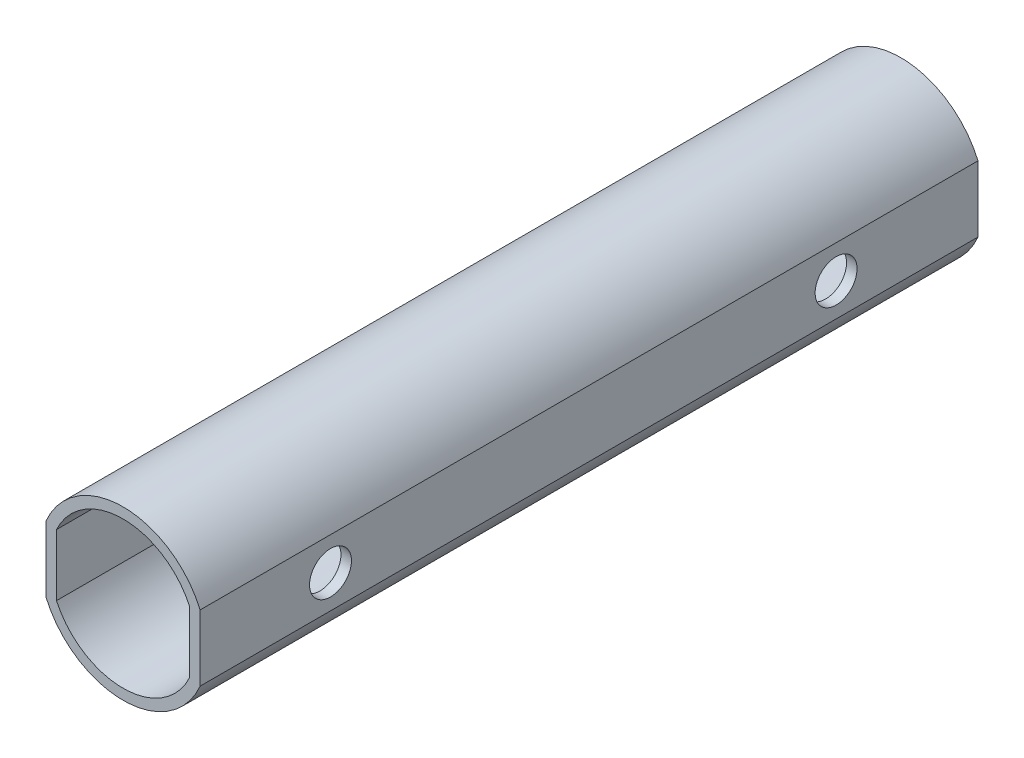
ISO-10303-21;
HEADER;
FILE_DESCRIPTION(('STEP AP214'),'2;1');
FILE_NAME('part.step','',(''),(''),'','','');
FILE_SCHEMA(('AUTOMOTIVE_DESIGN { 1 0 10303 214 1 1 1 1 }'));
ENDSEC;
DATA;
#1=APPLICATION_CONTEXT('core data for automotive mechanical design processes');
#2=APPLICATION_PROTOCOL_DEFINITION('international standard','automotive_design',2000,#1);
#3=PRODUCT_CONTEXT('',#1,'mechanical');
#4=PRODUCT('Part','Part','',(#3));
#5=PRODUCT_RELATED_PRODUCT_CATEGORY('part','',(#4));
#6=PRODUCT_DEFINITION_FORMATION('','',#4);
#7=PRODUCT_DEFINITION_CONTEXT('part definition',#1,'design');
#8=PRODUCT_DEFINITION('design','',#6,#7);
#9=PRODUCT_DEFINITION_SHAPE('','',#8);
#10=(LENGTH_UNIT() NAMED_UNIT(*) SI_UNIT(.MILLI.,.METRE.));
#11=(NAMED_UNIT(*) PLANE_ANGLE_UNIT() SI_UNIT($,.RADIAN.));
#12=(NAMED_UNIT(*) SI_UNIT($,.STERADIAN.) SOLID_ANGLE_UNIT());
#13=UNCERTAINTY_MEASURE_WITH_UNIT(LENGTH_MEASURE(1.E-05),#10,'distance_accuracy_value','');
#14=(GEOMETRIC_REPRESENTATION_CONTEXT(3) GLOBAL_UNCERTAINTY_ASSIGNED_CONTEXT((#13)) GLOBAL_UNIT_ASSIGNED_CONTEXT((#10,
#11,#12)) REPRESENTATION_CONTEXT('',''));
#15=CARTESIAN_POINT('',(0.,0.,0.));
#16=DIRECTION('',(0.,0.,1.));
#17=DIRECTION('',(1.,0.,0.));
#18=AXIS2_PLACEMENT_3D('',#15,#16,#17);
#19=CARTESIAN_POINT('',(0.,0.,117.85));
#20=DIRECTION('',(0.,0.,1.));
#21=DIRECTION('',(1.,0.,0.));
#22=AXIS2_PLACEMENT_3D('',#19,#20,#21);
#23=PLANE('',#22);
#24=CARTESIAN_POINT('',(0.,0.,117.85));
#25=DIRECTION('',(0.,0.,1.));
#26=DIRECTION('',(1.,0.,0.));
#27=AXIS2_PLACEMENT_3D('',#24,#25,#26);
#28=CIRCLE('',#27,12.7);
#29=CARTESIAN_POINT('',(11.6743308159397,5.,117.85));
#30=VERTEX_POINT('',#29);
#31=CARTESIAN_POINT('',(-11.6743308159397,5.,117.85));
#32=VERTEX_POINT('',#31);
#33=EDGE_CURVE('E142',#30,#32,#28,.T.);
#34=ORIENTED_EDGE('',*,*,#33,.T.);
#35=DIRECTION('',(0.,-1.,0.));
#36=VECTOR('',#35,1.);
#37=CARTESIAN_POINT('',(-11.6743308159397,5.,117.85));
#38=LINE('',#37,#36);
#39=CARTESIAN_POINT('',(-11.6743308159397,-4.99999999999999,117.85));
#40=VERTEX_POINT('',#39);
#41=EDGE_CURVE('E145',#32,#40,#38,.T.);
#42=ORIENTED_EDGE('',*,*,#41,.T.);
#43=CARTESIAN_POINT('',(0.,0.,117.85));
#44=DIRECTION('',(0.,0.,1.));
#45=DIRECTION('',(1.,0.,0.));
#46=AXIS2_PLACEMENT_3D('',#43,#44,#45);
#47=CIRCLE('',#46,12.7);
#48=CARTESIAN_POINT('',(11.6743308159397,-5.,117.85));
#49=VERTEX_POINT('',#48);
#50=EDGE_CURVE('E148',#40,#49,#47,.T.);
#51=ORIENTED_EDGE('',*,*,#50,.T.);
#52=DIRECTION('',(0.,1.,0.));
#53=VECTOR('',#52,1.);
#54=CARTESIAN_POINT('',(11.6743308159397,5.,117.85));
#55=LINE('',#54,#53);
#56=EDGE_CURVE('E150',#49,#30,#55,.T.);
#57=ORIENTED_EDGE('',*,*,#56,.T.);
#58=EDGE_LOOP('',(#34,#42,#51,#57));
#59=FACE_BOUND('',#58,.T.);
#60=DIRECTION('',(0.,-1.,0.));
#61=VECTOR('',#60,1.);
#62=CARTESIAN_POINT('',(-10.0868308159397,4.66299263784629,117.85));
#63=LINE('',#62,#61);
#64=CARTESIAN_POINT('',(-10.0868308159397,4.66299263784629,117.85));
#65=VERTEX_POINT('',#64);
#66=CARTESIAN_POINT('',(-10.0868308159397,-4.66299263784629,117.85));
#67=VERTEX_POINT('',#66);
#68=EDGE_CURVE('E112',#65,#67,#63,.T.);
#69=ORIENTED_EDGE('',*,*,#68,.F.);
#70=CARTESIAN_POINT('',(0.,0.,117.85));
#71=DIRECTION('',(0.,0.,1.));
#72=DIRECTION('',(1.,0.,0.));
#73=AXIS2_PLACEMENT_3D('',#70,#71,#72);
#74=CIRCLE('',#73,11.1125);
#75=CARTESIAN_POINT('',(10.0868308159397,4.66299263784629,117.85));
#76=VERTEX_POINT('',#75);
#77=EDGE_CURVE('E104',#76,#65,#74,.T.);
#78=ORIENTED_EDGE('',*,*,#77,.F.);
#79=DIRECTION('',(0.,1.,0.));
#80=VECTOR('',#79,1.);
#81=CARTESIAN_POINT('',(10.0868308159397,4.66299263784629,117.85));
#82=LINE('',#81,#80);
#83=CARTESIAN_POINT('',(10.0868308159397,-4.66299263784629,117.85));
#84=VERTEX_POINT('',#83);
#85=EDGE_CURVE('E126',#84,#76,#82,.T.);
#86=ORIENTED_EDGE('',*,*,#85,.F.);
#87=CARTESIAN_POINT('',(0.,0.,117.85));
#88=DIRECTION('',(0.,0.,1.));
#89=DIRECTION('',(1.,0.,0.));
#90=AXIS2_PLACEMENT_3D('',#87,#88,#89);
#91=CIRCLE('',#90,11.1125);
#92=EDGE_CURVE('E124',#67,#84,#91,.T.);
#93=ORIENTED_EDGE('',*,*,#92,.F.);
#94=EDGE_LOOP('',(#69,#78,#86,#93));
#95=FACE_BOUND('',#94,.T.);
#96=ADVANCED_FACE('F37',(#59,#95),#23,.T.);
#97=CARTESIAN_POINT('',(0.,0.,0.));
#98=DIRECTION('',(0.,0.,1.));
#99=DIRECTION('',(1.,0.,0.));
#100=AXIS2_PLACEMENT_3D('',#97,#98,#99);
#101=PLANE('',#100);
#102=CARTESIAN_POINT('',(0.,0.,0.));
#103=DIRECTION('',(0.,0.,1.));
#104=DIRECTION('',(1.,0.,0.));
#105=AXIS2_PLACEMENT_3D('',#102,#103,#104);
#106=CIRCLE('',#105,12.7);
#107=CARTESIAN_POINT('',(11.6743308159397,5.,0.));
#108=VERTEX_POINT('',#107);
#109=CARTESIAN_POINT('',(-11.6743308159397,5.,0.));
#110=VERTEX_POINT('',#109);
#111=EDGE_CURVE('E120',#108,#110,#106,.T.);
#112=ORIENTED_EDGE('',*,*,#111,.F.);
#113=DIRECTION('',(0.,1.,0.));
#114=VECTOR('',#113,1.);
#115=CARTESIAN_POINT('',(11.6743308159397,5.,0.));
#116=LINE('',#115,#114);
#117=CARTESIAN_POINT('',(11.6743308159397,-5.,0.));
#118=VERTEX_POINT('',#117);
#119=EDGE_CURVE('E146',#118,#108,#116,.T.);
#120=ORIENTED_EDGE('',*,*,#119,.F.);
#121=CARTESIAN_POINT('',(0.,0.,0.));
#122=DIRECTION('',(0.,0.,1.));
#123=DIRECTION('',(1.,0.,0.));
#124=AXIS2_PLACEMENT_3D('',#121,#122,#123);
#125=CIRCLE('',#124,12.7);
#126=CARTESIAN_POINT('',(-11.6743308159397,-4.99999999999999,0.));
#127=VERTEX_POINT('',#126);
#128=EDGE_CURVE('E157',#127,#118,#125,.T.);
#129=ORIENTED_EDGE('',*,*,#128,.F.);
#130=DIRECTION('',(0.,-1.,0.));
#131=VECTOR('',#130,1.);
#132=CARTESIAN_POINT('',(-11.6743308159397,5.,0.));
#133=LINE('',#132,#131);
#134=EDGE_CURVE('E155',#110,#127,#133,.T.);
#135=ORIENTED_EDGE('',*,*,#134,.F.);
#136=EDGE_LOOP('',(#112,#120,#129,#135));
#137=FACE_BOUND('',#136,.T.);
#138=CARTESIAN_POINT('',(0.,0.,0.));
#139=DIRECTION('',(0.,0.,1.));
#140=DIRECTION('',(1.,0.,0.));
#141=AXIS2_PLACEMENT_3D('',#138,#139,#140);
#142=CIRCLE('',#141,11.1125);
#143=CARTESIAN_POINT('',(10.0868308159397,4.66299263784629,0.));
#144=VERTEX_POINT('',#143);
#145=CARTESIAN_POINT('',(-10.0868308159397,4.66299263784629,0.));
#146=VERTEX_POINT('',#145);
#147=EDGE_CURVE('E62',#144,#146,#142,.T.);
#148=ORIENTED_EDGE('',*,*,#147,.T.);
#149=DIRECTION('',(0.,-1.,0.));
#150=VECTOR('',#149,1.);
#151=CARTESIAN_POINT('',(-10.0868308159397,4.66299263784629,0.));
#152=LINE('',#151,#150);
#153=CARTESIAN_POINT('',(-10.0868308159397,-4.66299263784629,0.));
#154=VERTEX_POINT('',#153);
#155=EDGE_CURVE('E119',#146,#154,#152,.T.);
#156=ORIENTED_EDGE('',*,*,#155,.T.);
#157=CARTESIAN_POINT('',(0.,0.,0.));
#158=DIRECTION('',(0.,0.,1.));
#159=DIRECTION('',(1.,0.,0.));
#160=AXIS2_PLACEMENT_3D('',#157,#158,#159);
#161=CIRCLE('',#160,11.1125);
#162=CARTESIAN_POINT('',(10.0868308159397,-4.66299263784629,0.));
#163=VERTEX_POINT('',#162);
#164=EDGE_CURVE('E134',#154,#163,#161,.T.);
#165=ORIENTED_EDGE('',*,*,#164,.T.);
#166=DIRECTION('',(0.,1.,0.));
#167=VECTOR('',#166,1.);
#168=CARTESIAN_POINT('',(10.0868308159397,4.66299263784629,0.));
#169=LINE('',#168,#167);
#170=EDGE_CURVE('E113',#163,#144,#169,.T.);
#171=ORIENTED_EDGE('',*,*,#170,.T.);
#172=EDGE_LOOP('',(#148,#156,#165,#171));
#173=FACE_BOUND('',#172,.T.);
#174=ADVANCED_FACE('F204',(#137,#173),#101,.F.);
#175=CARTESIAN_POINT('',(0.,0.,117.85));
#176=DIRECTION('',(0.,0.,-1.));
#177=DIRECTION('',(-1.,0.,0.));
#178=AXIS2_PLACEMENT_3D('',#175,#176,#177);
#179=CYLINDRICAL_SURFACE('',#178,12.7);
#180=ORIENTED_EDGE('',*,*,#111,.T.);
#181=DIRECTION('',(0.,0.,-1.));
#182=VECTOR('',#181,1.);
#183=CARTESIAN_POINT('',(-11.6743308159397,5.,117.85));
#184=LINE('',#183,#182);
#185=EDGE_CURVE('E11',#32,#110,#184,.T.);
#186=ORIENTED_EDGE('',*,*,#185,.F.);
#187=ORIENTED_EDGE('',*,*,#33,.F.);
#188=DIRECTION('',(0.,0.,-1.));
#189=VECTOR('',#188,1.);
#190=CARTESIAN_POINT('',(11.6743308159397,5.,117.85));
#191=LINE('',#190,#189);
#192=EDGE_CURVE('E152',#30,#108,#191,.T.);
#193=ORIENTED_EDGE('',*,*,#192,.T.);
#194=EDGE_LOOP('',(#180,#186,#187,#193));
#195=FACE_BOUND('',#194,.T.);
#196=ADVANCED_FACE('F39',(#195),#179,.T.);
#197=CARTESIAN_POINT('',(-11.6743308159397,5.,117.85));
#198=DIRECTION('',(1.,0.,0.));
#199=DIRECTION('',(0.,0.,-1.));
#200=AXIS2_PLACEMENT_3D('',#197,#198,#199);
#201=PLANE('',#200);
#202=CARTESIAN_POINT('',(-11.6743308159397,0.,21.5));
#203=DIRECTION('',(1.,0.,0.));
#204=DIRECTION('',(0.,0.,-1.));
#205=AXIS2_PLACEMENT_3D('',#202,#203,#204);
#206=CIRCLE('',#205,3.175);
#207=CARTESIAN_POINT('',(-11.6743308159397,0.,18.325));
#208=VERTEX_POINT('',#207);
#209=EDGE_CURVE('E169',#208,#208,#206,.F.);
#210=ORIENTED_EDGE('',*,*,#209,.F.);
#211=EDGE_LOOP('',(#210));
#212=FACE_BOUND('',#211,.T.);
#213=CARTESIAN_POINT('',(-11.6743308159397,0.,98.1));
#214=DIRECTION('',(1.,0.,0.));
#215=DIRECTION('',(0.,0.,-1.));
#216=AXIS2_PLACEMENT_3D('',#213,#214,#215);
#217=CIRCLE('',#216,3.175);
#218=CARTESIAN_POINT('',(-11.6743308159397,0.,94.925));
#219=VERTEX_POINT('',#218);
#220=EDGE_CURVE('E183',#219,#219,#217,.F.);
#221=ORIENTED_EDGE('',*,*,#220,.F.);
#222=EDGE_LOOP('',(#221));
#223=FACE_BOUND('',#222,.T.);
#224=ORIENTED_EDGE('',*,*,#134,.T.);
#225=DIRECTION('',(0.,0.,-1.));
#226=VECTOR('',#225,1.);
#227=CARTESIAN_POINT('',(-11.6743308159397,-4.99999999999999,117.85));
#228=LINE('',#227,#226);
#229=EDGE_CURVE('E46',#40,#127,#228,.T.);
#230=ORIENTED_EDGE('',*,*,#229,.F.);
#231=ORIENTED_EDGE('',*,*,#41,.F.);
#232=ORIENTED_EDGE('',*,*,#185,.T.);
#233=EDGE_LOOP('',(#224,#230,#231,#232));
#234=FACE_BOUND('',#233,.T.);
#235=ADVANCED_FACE('F229',(#212,#223,#234),#201,.F.);
#236=CARTESIAN_POINT('',(0.,0.,117.85));
#237=DIRECTION('',(0.,0.,-1.));
#238=DIRECTION('',(-1.,0.,0.));
#239=AXIS2_PLACEMENT_3D('',#236,#237,#238);
#240=CYLINDRICAL_SURFACE('',#239,12.7);
#241=ORIENTED_EDGE('',*,*,#128,.T.);
#242=DIRECTION('',(0.,0.,-1.));
#243=VECTOR('',#242,1.);
#244=CARTESIAN_POINT('',(11.6743308159397,-5.,117.85));
#245=LINE('',#244,#243);
#246=EDGE_CURVE('E162',#49,#118,#245,.T.);
#247=ORIENTED_EDGE('',*,*,#246,.F.);
#248=ORIENTED_EDGE('',*,*,#50,.F.);
#249=ORIENTED_EDGE('',*,*,#229,.T.);
#250=EDGE_LOOP('',(#241,#247,#248,#249));
#251=FACE_BOUND('',#250,.T.);
#252=ADVANCED_FACE('F226',(#251),#240,.T.);
#253=CARTESIAN_POINT('',(11.6743308159397,5.,117.85));
#254=DIRECTION('',(-1.,0.,0.));
#255=DIRECTION('',(0.,0.,1.));
#256=AXIS2_PLACEMENT_3D('',#253,#254,#255);
#257=PLANE('',#256);
#258=CARTESIAN_POINT('',(11.6743308159397,0.,21.5));
#259=DIRECTION('',(1.,0.,0.));
#260=DIRECTION('',(0.,0.,-1.));
#261=AXIS2_PLACEMENT_3D('',#258,#259,#260);
#262=CIRCLE('',#261,3.175);
#263=CARTESIAN_POINT('',(11.6743308159397,0.,18.325));
#264=VERTEX_POINT('',#263);
#265=EDGE_CURVE('E175',#264,#264,#262,.T.);
#266=ORIENTED_EDGE('',*,*,#265,.F.);
#267=EDGE_LOOP('',(#266));
#268=FACE_BOUND('',#267,.T.);
#269=CARTESIAN_POINT('',(11.6743308159397,0.,98.1));
#270=DIRECTION('',(1.,0.,0.));
#271=DIRECTION('',(0.,0.,-1.));
#272=AXIS2_PLACEMENT_3D('',#269,#270,#271);
#273=CIRCLE('',#272,3.175);
#274=CARTESIAN_POINT('',(11.6743308159397,0.,94.925));
#275=VERTEX_POINT('',#274);
#276=EDGE_CURVE('E180',#275,#275,#273,.T.);
#277=ORIENTED_EDGE('',*,*,#276,.F.);
#278=EDGE_LOOP('',(#277));
#279=FACE_BOUND('',#278,.T.);
#280=ORIENTED_EDGE('',*,*,#119,.T.);
#281=ORIENTED_EDGE('',*,*,#192,.F.);
#282=ORIENTED_EDGE('',*,*,#56,.F.);
#283=ORIENTED_EDGE('',*,*,#246,.T.);
#284=EDGE_LOOP('',(#280,#281,#282,#283));
#285=FACE_BOUND('',#284,.T.);
#286=ADVANCED_FACE('F223',(#268,#279,#285),#257,.F.);
#287=CARTESIAN_POINT('',(0.,0.,117.85));
#288=DIRECTION('',(0.,0.,-1.));
#289=DIRECTION('',(-1.,0.,0.));
#290=AXIS2_PLACEMENT_3D('',#287,#288,#289);
#291=CYLINDRICAL_SURFACE('',#290,11.1125);
#292=ORIENTED_EDGE('',*,*,#147,.F.);
#293=DIRECTION('',(0.,0.,-1.));
#294=VECTOR('',#293,1.);
#295=CARTESIAN_POINT('',(10.0868308159397,4.66299263784629,117.85));
#296=LINE('',#295,#294);
#297=EDGE_CURVE('E108',#76,#144,#296,.T.);
#298=ORIENTED_EDGE('',*,*,#297,.F.);
#299=ORIENTED_EDGE('',*,*,#77,.T.);
#300=DIRECTION('',(0.,0.,-1.));
#301=VECTOR('',#300,1.);
#302=CARTESIAN_POINT('',(-10.0868308159397,4.66299263784629,117.85));
#303=LINE('',#302,#301);
#304=EDGE_CURVE('E107',#65,#146,#303,.T.);
#305=ORIENTED_EDGE('',*,*,#304,.T.);
#306=EDGE_LOOP('',(#292,#298,#299,#305));
#307=FACE_BOUND('',#306,.T.);
#308=ADVANCED_FACE('F106',(#307),#291,.F.);
#309=CARTESIAN_POINT('',(-10.0868308159397,4.66299263784629,117.85));
#310=DIRECTION('',(1.,0.,0.));
#311=DIRECTION('',(0.,0.,-1.));
#312=AXIS2_PLACEMENT_3D('',#309,#310,#311);
#313=PLANE('',#312);
#314=CARTESIAN_POINT('',(-10.0868308159397,0.,21.5));
#315=DIRECTION('',(1.,0.,0.));
#316=DIRECTION('',(0.,0.,-1.));
#317=AXIS2_PLACEMENT_3D('',#314,#315,#316);
#318=CIRCLE('',#317,3.175);
#319=CARTESIAN_POINT('',(-10.0868308159397,0.,18.325));
#320=VERTEX_POINT('',#319);
#321=EDGE_CURVE('E132',#320,#320,#318,.T.);
#322=ORIENTED_EDGE('',*,*,#321,.F.);
#323=EDGE_LOOP('',(#322));
#324=FACE_BOUND('',#323,.T.);
#325=CARTESIAN_POINT('',(-10.0868308159397,0.,98.1));
#326=DIRECTION('',(1.,0.,0.));
#327=DIRECTION('',(0.,0.,-1.));
#328=AXIS2_PLACEMENT_3D('',#325,#326,#327);
#329=CIRCLE('',#328,3.175);
#330=CARTESIAN_POINT('',(-10.0868308159397,0.,94.925));
#331=VERTEX_POINT('',#330);
#332=EDGE_CURVE('E168',#331,#331,#329,.T.);
#333=ORIENTED_EDGE('',*,*,#332,.F.);
#334=EDGE_LOOP('',(#333));
#335=FACE_BOUND('',#334,.T.);
#336=ORIENTED_EDGE('',*,*,#155,.F.);
#337=ORIENTED_EDGE('',*,*,#304,.F.);
#338=ORIENTED_EDGE('',*,*,#68,.T.);
#339=DIRECTION('',(0.,0.,-1.));
#340=VECTOR('',#339,1.);
#341=CARTESIAN_POINT('',(-10.0868308159397,-4.66299263784629,117.85));
#342=LINE('',#341,#340);
#343=EDGE_CURVE('E121',#67,#154,#342,.T.);
#344=ORIENTED_EDGE('',*,*,#343,.T.);
#345=EDGE_LOOP('',(#336,#337,#338,#344));
#346=FACE_BOUND('',#345,.T.);
#347=ADVANCED_FACE('F116',(#324,#335,#346),#313,.T.);
#348=CARTESIAN_POINT('',(0.,0.,117.85));
#349=DIRECTION('',(0.,0.,-1.));
#350=DIRECTION('',(-1.,0.,0.));
#351=AXIS2_PLACEMENT_3D('',#348,#349,#350);
#352=CYLINDRICAL_SURFACE('',#351,11.1125);
#353=ORIENTED_EDGE('',*,*,#164,.F.);
#354=ORIENTED_EDGE('',*,*,#343,.F.);
#355=ORIENTED_EDGE('',*,*,#92,.T.);
#356=DIRECTION('',(0.,0.,-1.));
#357=VECTOR('',#356,1.);
#358=CARTESIAN_POINT('',(10.0868308159397,-4.66299263784629,117.85));
#359=LINE('',#358,#357);
#360=EDGE_CURVE('E54',#84,#163,#359,.T.);
#361=ORIENTED_EDGE('',*,*,#360,.T.);
#362=EDGE_LOOP('',(#353,#354,#355,#361));
#363=FACE_BOUND('',#362,.T.);
#364=ADVANCED_FACE('F200',(#363),#352,.F.);
#365=CARTESIAN_POINT('',(10.0868308159397,4.66299263784629,117.85));
#366=DIRECTION('',(-1.,0.,0.));
#367=DIRECTION('',(0.,0.,1.));
#368=AXIS2_PLACEMENT_3D('',#365,#366,#367);
#369=PLANE('',#368);
#370=CARTESIAN_POINT('',(10.0868308159397,0.,21.5));
#371=DIRECTION('',(-1.,0.,0.));
#372=DIRECTION('',(0.,0.,1.));
#373=AXIS2_PLACEMENT_3D('',#370,#371,#372);
#374=CIRCLE('',#373,3.175);
#375=CARTESIAN_POINT('',(10.0868308159397,0.,24.675));
#376=VERTEX_POINT('',#375);
#377=EDGE_CURVE('E41',#376,#376,#374,.T.);
#378=ORIENTED_EDGE('',*,*,#377,.F.);
#379=EDGE_LOOP('',(#378));
#380=FACE_BOUND('',#379,.T.);
#381=CARTESIAN_POINT('',(10.0868308159397,0.,98.1));
#382=DIRECTION('',(-1.,0.,0.));
#383=DIRECTION('',(0.,0.,1.));
#384=AXIS2_PLACEMENT_3D('',#381,#382,#383);
#385=CIRCLE('',#384,3.175);
#386=CARTESIAN_POINT('',(10.0868308159397,0.,101.275));
#387=VERTEX_POINT('',#386);
#388=EDGE_CURVE('E166',#387,#387,#385,.T.);
#389=ORIENTED_EDGE('',*,*,#388,.F.);
#390=EDGE_LOOP('',(#389));
#391=FACE_BOUND('',#390,.T.);
#392=ORIENTED_EDGE('',*,*,#170,.F.);
#393=ORIENTED_EDGE('',*,*,#360,.F.);
#394=ORIENTED_EDGE('',*,*,#85,.T.);
#395=ORIENTED_EDGE('',*,*,#297,.T.);
#396=EDGE_LOOP('',(#392,#393,#394,#395));
#397=FACE_BOUND('',#396,.T.);
#398=ADVANCED_FACE('F196',(#380,#391,#397),#369,.T.);
#399=CARTESIAN_POINT('',(-20.6545869370089,0.,98.1));
#400=DIRECTION('',(1.,0.,0.));
#401=DIRECTION('',(0.,0.,-1.));
#402=AXIS2_PLACEMENT_3D('',#399,#400,#401);
#403=CYLINDRICAL_SURFACE('',#402,3.175);
#404=ORIENTED_EDGE('',*,*,#388,.T.);
#405=EDGE_LOOP('',(#404));
#406=FACE_BOUND('',#405,.T.);
#407=ORIENTED_EDGE('',*,*,#276,.T.);
#408=EDGE_LOOP('',(#407));
#409=FACE_BOUND('',#408,.T.);
#410=ADVANCED_FACE('F199',(#406,#409),#403,.F.);
#411=CARTESIAN_POINT('',(-20.6545869370089,0.,21.5));
#412=DIRECTION('',(1.,0.,0.));
#413=DIRECTION('',(0.,0.,-1.));
#414=AXIS2_PLACEMENT_3D('',#411,#412,#413);
#415=CYLINDRICAL_SURFACE('',#414,3.175);
#416=ORIENTED_EDGE('',*,*,#377,.T.);
#417=EDGE_LOOP('',(#416));
#418=FACE_BOUND('',#417,.T.);
#419=ORIENTED_EDGE('',*,*,#265,.T.);
#420=EDGE_LOOP('',(#419));
#421=FACE_BOUND('',#420,.T.);
#422=ADVANCED_FACE('F193',(#418,#421),#415,.F.);
#423=CARTESIAN_POINT('',(-10.0868308159397,0.,94.925));
#424=CARTESIAN_POINT('',(-10.1033672742731,0.,94.925));
#425=CARTESIAN_POINT('',(-10.1199037326064,0.,94.925));
#426=CARTESIAN_POINT('',(-10.1529766492731,0.,94.925));
#427=CARTESIAN_POINT('',(-10.1695131076064,0.,94.925));
#428=CARTESIAN_POINT('',(-10.2025860242731,0.,94.925));
#429=CARTESIAN_POINT('',(-10.2191224826064,0.,94.925));
#430=CARTESIAN_POINT('',(-10.2521953992731,0.,94.925));
#431=CARTESIAN_POINT('',(-10.2687318576064,0.,94.925));
#432=CARTESIAN_POINT('',(-10.3018047742731,0.,94.925));
#433=CARTESIAN_POINT('',(-10.3183412326064,0.,94.925));
#434=CARTESIAN_POINT('',(-10.3514141492731,0.,94.925));
#435=CARTESIAN_POINT('',(-10.3679506076064,0.,94.925));
#436=CARTESIAN_POINT('',(-10.4010235242731,0.,94.925));
#437=CARTESIAN_POINT('',(-10.4175599826064,0.,94.925));
#438=CARTESIAN_POINT('',(-10.4506328992731,0.,94.925));
#439=CARTESIAN_POINT('',(-10.4671693576064,0.,94.925));
#440=CARTESIAN_POINT('',(-10.5002422742731,0.,94.925));
#441=CARTESIAN_POINT('',(-10.5167787326064,0.,94.925));
#442=CARTESIAN_POINT('',(-10.5498516492731,0.,94.925));
#443=CARTESIAN_POINT('',(-10.5663881076064,0.,94.925));
#444=CARTESIAN_POINT('',(-10.5994610242731,0.,94.925));
#445=CARTESIAN_POINT('',(-10.6159974826064,0.,94.925));
#446=CARTESIAN_POINT('',(-10.6490703992731,0.,94.925));
#447=CARTESIAN_POINT('',(-10.6656068576064,0.,94.925));
#448=CARTESIAN_POINT('',(-10.6986797742731,0.,94.925));
#449=CARTESIAN_POINT('',(-10.7152162326064,0.,94.925));
#450=CARTESIAN_POINT('',(-10.7482891492731,0.,94.925));
#451=CARTESIAN_POINT('',(-10.7648256076064,0.,94.925));
#452=CARTESIAN_POINT('',(-10.7978985242731,0.,94.925));
#453=CARTESIAN_POINT('',(-10.8144349826064,0.,94.925));
#454=CARTESIAN_POINT('',(-10.8475078992731,0.,94.925));
#455=CARTESIAN_POINT('',(-10.8640443576064,0.,94.925));
#456=CARTESIAN_POINT('',(-10.8971172742731,0.,94.925));
#457=CARTESIAN_POINT('',(-10.9136537326064,0.,94.925));
#458=CARTESIAN_POINT('',(-10.9467266492731,0.,94.925));
#459=CARTESIAN_POINT('',(-10.9632631076064,0.,94.925));
#460=CARTESIAN_POINT('',(-10.9963360242731,0.,94.925));
#461=CARTESIAN_POINT('',(-11.0128724826064,0.,94.925));
#462=CARTESIAN_POINT('',(-11.0459453992731,0.,94.925));
#463=CARTESIAN_POINT('',(-11.0624818576064,0.,94.925));
#464=CARTESIAN_POINT('',(-11.0955547742731,0.,94.925));
#465=CARTESIAN_POINT('',(-11.1120912326064,0.,94.925));
#466=CARTESIAN_POINT('',(-11.1451641492731,0.,94.925));
#467=CARTESIAN_POINT('',(-11.1617006076064,0.,94.925));
#468=CARTESIAN_POINT('',(-11.1947735242731,0.,94.925));
#469=CARTESIAN_POINT('',(-11.2113099826064,0.,94.925));
#470=CARTESIAN_POINT('',(-11.2443828992731,0.,94.925));
#471=CARTESIAN_POINT('',(-11.2609193576064,0.,94.925));
#472=CARTESIAN_POINT('',(-11.2939922742731,0.,94.925));
#473=CARTESIAN_POINT('',(-11.3105287326064,0.,94.925));
#474=CARTESIAN_POINT('',(-11.3436016492731,0.,94.925));
#475=CARTESIAN_POINT('',(-11.3601381076064,0.,94.925));
#476=CARTESIAN_POINT('',(-11.3932110242731,0.,94.925));
#477=CARTESIAN_POINT('',(-11.4097474826064,0.,94.925));
#478=CARTESIAN_POINT('',(-11.4428203992731,0.,94.925));
#479=CARTESIAN_POINT('',(-11.4593568576064,0.,94.925));
#480=CARTESIAN_POINT('',(-11.4924297742731,0.,94.925));
#481=CARTESIAN_POINT('',(-11.5089662326064,0.,94.925));
#482=CARTESIAN_POINT('',(-11.5420391492731,0.,94.925));
#483=CARTESIAN_POINT('',(-11.5585756076064,0.,94.925));
#484=CARTESIAN_POINT('',(-11.5916485242731,0.,94.925));
#485=CARTESIAN_POINT('',(-11.6081849826064,0.,94.925));
#486=CARTESIAN_POINT('',(-11.6412578992731,0.,94.925));
#487=CARTESIAN_POINT('',(-11.6577943576064,0.,94.925));
#488=CARTESIAN_POINT('',(-11.6743308159397,0.,94.925));
#489=B_SPLINE_CURVE_WITH_KNOTS('',3,(#423,#424,#425,#426,#427,#428,#429,#430,#431,#432,#433,
#434,#435,#436,#437,#438,#439,#440,#441,#442,#443,#444,#445,#446,#447,#448,#449,#450,#451,#452,
#453,#454,#455,#456,#457,#458,#459,#460,#461,#462,#463,#464,#465,#466,#467,#468,#469,#470,#471,
#472,#473,#474,#475,#476,#477,#478,#479,#480,#481,#482,#483,#484,#485,#486,#487,#488),
.UNSPECIFIED.,.F.,.F.,(4,2,2,2,2,2,2,2,2,2,2,2,2,2,2,2,2,2,2,2,2,2,2,2,2,2,2,2,2,2,2,2,4),(0.,
0.0496093750000006,0.0992187499999995,0.148828125,0.198437500000001,0.248046875,0.29765625,
0.347265625000001,0.396875000000001,0.446484375,0.496093750000001,0.545703125000002,0.5953125,
0.644921875000001,0.694531250000002,0.744140625,0.793750000000001,0.843359375000002,
0.892968750000001,0.942578125000001,0.992187500000002,1.041796875,1.09140625,1.141015625,
1.190625,1.240234375,1.28984375,1.339453125,1.3890625,1.438671875,1.48828125,1.537890625,
1.5875),.UNSPECIFIED.);
#490=EDGE_CURVE('BSEAM252',#331,#219,#489,.T.);
#491=ORIENTED_EDGE('',*,*,#332,.T.);
#492=ORIENTED_EDGE('',*,*,#220,.T.);
#493=ORIENTED_EDGE('',*,*,#490,.T.);
#494=ORIENTED_EDGE('',*,*,#490,.F.);
#495=EDGE_LOOP('',(#491,#493,#492,#494));
#496=FACE_BOUND('',#495,.T.);
#497=ADVANCED_FACE('F252',(#496),#403,.F.);
#498=CARTESIAN_POINT('',(-10.0868308159397,0.,18.325));
#499=CARTESIAN_POINT('',(-10.1033672742731,0.,18.325));
#500=CARTESIAN_POINT('',(-10.1199037326064,0.,18.325));
#501=CARTESIAN_POINT('',(-10.1529766492731,0.,18.325));
#502=CARTESIAN_POINT('',(-10.1695131076064,0.,18.325));
#503=CARTESIAN_POINT('',(-10.2025860242731,0.,18.325));
#504=CARTESIAN_POINT('',(-10.2191224826064,0.,18.325));
#505=CARTESIAN_POINT('',(-10.2521953992731,0.,18.325));
#506=CARTESIAN_POINT('',(-10.2687318576064,0.,18.325));
#507=CARTESIAN_POINT('',(-10.3018047742731,0.,18.325));
#508=CARTESIAN_POINT('',(-10.3183412326064,0.,18.325));
#509=CARTESIAN_POINT('',(-10.3514141492731,0.,18.325));
#510=CARTESIAN_POINT('',(-10.3679506076064,0.,18.325));
#511=CARTESIAN_POINT('',(-10.4010235242731,0.,18.325));
#512=CARTESIAN_POINT('',(-10.4175599826064,0.,18.325));
#513=CARTESIAN_POINT('',(-10.4506328992731,0.,18.325));
#514=CARTESIAN_POINT('',(-10.4671693576064,0.,18.325));
#515=CARTESIAN_POINT('',(-10.5002422742731,0.,18.325));
#516=CARTESIAN_POINT('',(-10.5167787326064,0.,18.325));
#517=CARTESIAN_POINT('',(-10.5498516492731,0.,18.325));
#518=CARTESIAN_POINT('',(-10.5663881076064,0.,18.325));
#519=CARTESIAN_POINT('',(-10.5994610242731,0.,18.325));
#520=CARTESIAN_POINT('',(-10.6159974826064,0.,18.325));
#521=CARTESIAN_POINT('',(-10.6490703992731,0.,18.325));
#522=CARTESIAN_POINT('',(-10.6656068576064,0.,18.325));
#523=CARTESIAN_POINT('',(-10.6986797742731,0.,18.325));
#524=CARTESIAN_POINT('',(-10.7152162326064,0.,18.325));
#525=CARTESIAN_POINT('',(-10.7482891492731,0.,18.325));
#526=CARTESIAN_POINT('',(-10.7648256076064,0.,18.325));
#527=CARTESIAN_POINT('',(-10.7978985242731,0.,18.325));
#528=CARTESIAN_POINT('',(-10.8144349826064,0.,18.325));
#529=CARTESIAN_POINT('',(-10.8475078992731,0.,18.325));
#530=CARTESIAN_POINT('',(-10.8640443576064,0.,18.325));
#531=CARTESIAN_POINT('',(-10.8971172742731,0.,18.325));
#532=CARTESIAN_POINT('',(-10.9136537326064,0.,18.325));
#533=CARTESIAN_POINT('',(-10.9467266492731,0.,18.325));
#534=CARTESIAN_POINT('',(-10.9632631076064,0.,18.325));
#535=CARTESIAN_POINT('',(-10.9963360242731,0.,18.325));
#536=CARTESIAN_POINT('',(-11.0128724826064,0.,18.325));
#537=CARTESIAN_POINT('',(-11.0459453992731,0.,18.325));
#538=CARTESIAN_POINT('',(-11.0624818576064,0.,18.325));
#539=CARTESIAN_POINT('',(-11.0955547742731,0.,18.325));
#540=CARTESIAN_POINT('',(-11.1120912326064,0.,18.325));
#541=CARTESIAN_POINT('',(-11.1451641492731,0.,18.325));
#542=CARTESIAN_POINT('',(-11.1617006076064,0.,18.325));
#543=CARTESIAN_POINT('',(-11.1947735242731,0.,18.325));
#544=CARTESIAN_POINT('',(-11.2113099826064,0.,18.325));
#545=CARTESIAN_POINT('',(-11.2443828992731,0.,18.325));
#546=CARTESIAN_POINT('',(-11.2609193576064,0.,18.325));
#547=CARTESIAN_POINT('',(-11.2939922742731,0.,18.325));
#548=CARTESIAN_POINT('',(-11.3105287326064,0.,18.325));
#549=CARTESIAN_POINT('',(-11.3436016492731,0.,18.325));
#550=CARTESIAN_POINT('',(-11.3601381076064,0.,18.325));
#551=CARTESIAN_POINT('',(-11.3932110242731,0.,18.325));
#552=CARTESIAN_POINT('',(-11.4097474826064,0.,18.325));
#553=CARTESIAN_POINT('',(-11.4428203992731,0.,18.325));
#554=CARTESIAN_POINT('',(-11.4593568576064,0.,18.325));
#555=CARTESIAN_POINT('',(-11.4924297742731,0.,18.325));
#556=CARTESIAN_POINT('',(-11.5089662326064,0.,18.325));
#557=CARTESIAN_POINT('',(-11.5420391492731,0.,18.325));
#558=CARTESIAN_POINT('',(-11.5585756076064,0.,18.325));
#559=CARTESIAN_POINT('',(-11.5916485242731,0.,18.325));
#560=CARTESIAN_POINT('',(-11.6081849826064,0.,18.325));
#561=CARTESIAN_POINT('',(-11.6412578992731,0.,18.325));
#562=CARTESIAN_POINT('',(-11.6577943576064,0.,18.325));
#563=CARTESIAN_POINT('',(-11.6743308159397,0.,18.325));
#564=B_SPLINE_CURVE_WITH_KNOTS('',3,(#498,#499,#500,#501,#502,#503,#504,#505,#506,#507,#508,
#509,#510,#511,#512,#513,#514,#515,#516,#517,#518,#519,#520,#521,#522,#523,#524,#525,#526,#527,
#528,#529,#530,#531,#532,#533,#534,#535,#536,#537,#538,#539,#540,#541,#542,#543,#544,#545,#546,
#547,#548,#549,#550,#551,#552,#553,#554,#555,#556,#557,#558,#559,#560,#561,#562,#563),
.UNSPECIFIED.,.F.,.F.,(4,2,2,2,2,2,2,2,2,2,2,2,2,2,2,2,2,2,2,2,2,2,2,2,2,2,2,2,2,2,2,2,4),(0.,
0.0496093750000006,0.0992187499999995,0.148828125,0.198437500000001,0.248046875,0.29765625,
0.347265625000001,0.396875000000001,0.446484375,0.496093750000001,0.545703125000002,0.5953125,
0.644921875000001,0.694531250000002,0.744140625,0.793750000000001,0.843359375000002,
0.892968750000001,0.942578125000001,0.992187500000002,1.041796875,1.09140625,1.141015625,
1.190625,1.240234375,1.28984375,1.339453125,1.3890625,1.438671875,1.48828125,1.537890625,
1.5875),.UNSPECIFIED.);
#565=EDGE_CURVE('BSEAM254',#320,#208,#564,.T.);
#566=ORIENTED_EDGE('',*,*,#321,.T.);
#567=ORIENTED_EDGE('',*,*,#209,.T.);
#568=ORIENTED_EDGE('',*,*,#565,.T.);
#569=ORIENTED_EDGE('',*,*,#565,.F.);
#570=EDGE_LOOP('',(#566,#568,#567,#569));
#571=FACE_BOUND('',#570,.T.);
#572=ADVANCED_FACE('F254',(#571),#415,.F.);
#573=CLOSED_SHELL('',(#96,#174,#196,#235,#252,#286,#308,#347,#364,#398,#410,#422,#497,#572));
#574=MANIFOLD_SOLID_BREP('B2',#573);
#575=ADVANCED_BREP_SHAPE_REPRESENTATION('',(#18,#574),#14);
#576=SHAPE_DEFINITION_REPRESENTATION(#9,#575);
ENDSEC;
END-ISO-10303-21;
